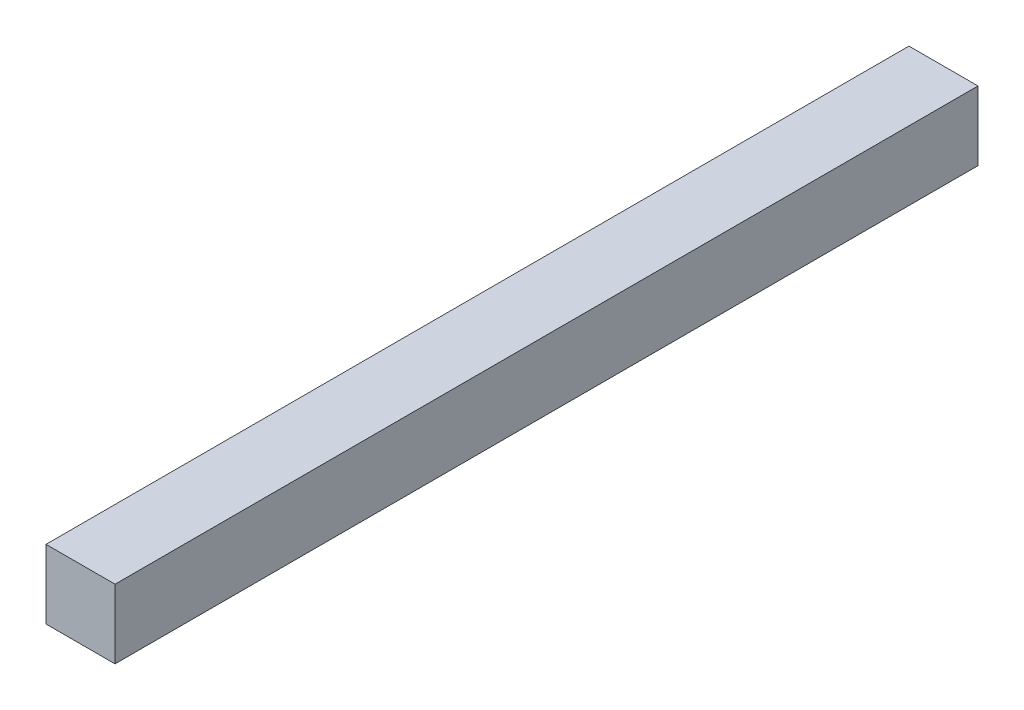
ISO-10303-21;
HEADER;
FILE_DESCRIPTION(('STEP AP214'),'2;1');
FILE_NAME('part.step','',(''),(''),'','','');
FILE_SCHEMA(('AUTOMOTIVE_DESIGN { 1 0 10303 214 1 1 1 1 }'));
ENDSEC;
DATA;
#1=APPLICATION_CONTEXT('core data for automotive mechanical design processes');
#2=APPLICATION_PROTOCOL_DEFINITION('international standard','automotive_design',2000,#1);
#3=PRODUCT_CONTEXT('',#1,'mechanical');
#4=PRODUCT('Part','Part','',(#3));
#5=PRODUCT_RELATED_PRODUCT_CATEGORY('part','',(#4));
#6=PRODUCT_DEFINITION_FORMATION('','',#4);
#7=PRODUCT_DEFINITION_CONTEXT('part definition',#1,'design');
#8=PRODUCT_DEFINITION('design','',#6,#7);
#9=PRODUCT_DEFINITION_SHAPE('','',#8);
#10=(LENGTH_UNIT() NAMED_UNIT(*) SI_UNIT(.MILLI.,.METRE.));
#11=(NAMED_UNIT(*) PLANE_ANGLE_UNIT() SI_UNIT($,.RADIAN.));
#12=(NAMED_UNIT(*) SI_UNIT($,.STERADIAN.) SOLID_ANGLE_UNIT());
#13=UNCERTAINTY_MEASURE_WITH_UNIT(LENGTH_MEASURE(1.E-05),#10,'distance_accuracy_value','');
#14=(GEOMETRIC_REPRESENTATION_CONTEXT(3) GLOBAL_UNCERTAINTY_ASSIGNED_CONTEXT((#13)) GLOBAL_UNIT_ASSIGNED_CONTEXT((#10,
#11,#12)) REPRESENTATION_CONTEXT('',''));
#15=CARTESIAN_POINT('',(0.,0.,0.));
#16=DIRECTION('',(0.,0.,1.));
#17=DIRECTION('',(1.,0.,0.));
#18=AXIS2_PLACEMENT_3D('',#15,#16,#17);
#19=CARTESIAN_POINT('',(0.,40.,1000.));
#20=DIRECTION('',(0.,-1.,0.));
#21=DIRECTION('',(0.,0.,-1.));
#22=AXIS2_PLACEMENT_3D('',#19,#20,#21);
#23=PLANE('',#22);
#24=DIRECTION('',(-1.,0.,0.));
#25=VECTOR('',#24,1.);
#26=CARTESIAN_POINT('',(0.,40.,0.));
#27=LINE('',#26,#25);
#28=CARTESIAN_POINT('',(40.,40.,0.));
#29=VERTEX_POINT('',#28);
#30=CARTESIAN_POINT('',(-40.,40.,0.));
#31=VERTEX_POINT('',#30);
#32=EDGE_CURVE('E73',#29,#31,#27,.T.);
#33=ORIENTED_EDGE('',*,*,#32,.T.);
#34=DIRECTION('',(0.,0.,-1.));
#35=VECTOR('',#34,1.);
#36=CARTESIAN_POINT('',(-40.,40.,1000.));
#37=LINE('',#36,#35);
#38=CARTESIAN_POINT('',(-40.,40.,1000.));
#39=VERTEX_POINT('',#38);
#40=EDGE_CURVE('E11',#39,#31,#37,.T.);
#41=ORIENTED_EDGE('',*,*,#40,.F.);
#42=DIRECTION('',(-1.,0.,0.));
#43=VECTOR('',#42,1.);
#44=CARTESIAN_POINT('',(40.,40.,1000.));
#45=LINE('',#44,#43);
#46=CARTESIAN_POINT('',(40.,40.,1000.));
#47=VERTEX_POINT('',#46);
#48=EDGE_CURVE('E77',#47,#39,#45,.T.);
#49=ORIENTED_EDGE('',*,*,#48,.F.);
#50=DIRECTION('',(0.,0.,-1.));
#51=VECTOR('',#50,1.);
#52=CARTESIAN_POINT('',(40.,40.,1000.));
#53=LINE('',#52,#51);
#54=EDGE_CURVE('E96',#47,#29,#53,.T.);
#55=ORIENTED_EDGE('',*,*,#54,.T.);
#56=EDGE_LOOP('',(#33,#41,#49,#55));
#57=FACE_BOUND('',#56,.T.);
#58=ADVANCED_FACE('F36',(#57),#23,.F.);
#59=CARTESIAN_POINT('',(-40.,40.,1000.));
#60=DIRECTION('',(1.,0.,0.));
#61=DIRECTION('',(0.,0.,-1.));
#62=AXIS2_PLACEMENT_3D('',#59,#60,#61);
#63=PLANE('',#62);
#64=DIRECTION('',(0.,-1.,0.));
#65=VECTOR('',#64,1.);
#66=CARTESIAN_POINT('',(-40.,40.,0.));
#67=LINE('',#66,#65);
#68=CARTESIAN_POINT('',(-40.,-40.,0.));
#69=VERTEX_POINT('',#68);
#70=EDGE_CURVE('E90',#31,#69,#67,.T.);
#71=ORIENTED_EDGE('',*,*,#70,.T.);
#72=DIRECTION('',(0.,0.,-1.));
#73=VECTOR('',#72,1.);
#74=CARTESIAN_POINT('',(-40.,-40.,1000.));
#75=LINE('',#74,#73);
#76=CARTESIAN_POINT('',(-40.,-40.,1000.));
#77=VERTEX_POINT('',#76);
#78=EDGE_CURVE('E44',#77,#69,#75,.T.);
#79=ORIENTED_EDGE('',*,*,#78,.F.);
#80=DIRECTION('',(0.,-1.,0.));
#81=VECTOR('',#80,1.);
#82=CARTESIAN_POINT('',(-40.,40.,1000.));
#83=LINE('',#82,#81);
#84=EDGE_CURVE('E80',#39,#77,#83,.T.);
#85=ORIENTED_EDGE('',*,*,#84,.F.);
#86=ORIENTED_EDGE('',*,*,#40,.T.);
#87=EDGE_LOOP('',(#71,#79,#85,#86));
#88=FACE_BOUND('',#87,.T.);
#89=ADVANCED_FACE('F89',(#88),#63,.F.);
#90=CARTESIAN_POINT('',(-40.,-40.,1000.));
#91=DIRECTION('',(0.,1.,0.));
#92=DIRECTION('',(0.,0.,1.));
#93=AXIS2_PLACEMENT_3D('',#90,#91,#92);
#94=PLANE('',#93);
#95=DIRECTION('',(1.,0.,0.));
#96=VECTOR('',#95,1.);
#97=CARTESIAN_POINT('',(-40.,-40.,0.));
#98=LINE('',#97,#96);
#99=CARTESIAN_POINT('',(40.,-40.,0.));
#100=VERTEX_POINT('',#99);
#101=EDGE_CURVE('E102',#69,#100,#98,.T.);
#102=ORIENTED_EDGE('',*,*,#101,.T.);
#103=DIRECTION('',(0.,0.,-1.));
#104=VECTOR('',#103,1.);
#105=CARTESIAN_POINT('',(40.,-40.,1000.));
#106=LINE('',#105,#104);
#107=CARTESIAN_POINT('',(40.,-40.,1000.));
#108=VERTEX_POINT('',#107);
#109=EDGE_CURVE('E92',#108,#100,#106,.T.);
#110=ORIENTED_EDGE('',*,*,#109,.F.);
#111=DIRECTION('',(1.,0.,0.));
#112=VECTOR('',#111,1.);
#113=CARTESIAN_POINT('',(-40.,-40.,1000.));
#114=LINE('',#113,#112);
#115=EDGE_CURVE('E84',#77,#108,#114,.T.);
#116=ORIENTED_EDGE('',*,*,#115,.F.);
#117=ORIENTED_EDGE('',*,*,#78,.T.);
#118=EDGE_LOOP('',(#102,#110,#116,#117));
#119=FACE_BOUND('',#118,.T.);
#120=ADVANCED_FACE('F93',(#119),#94,.F.);
#121=CARTESIAN_POINT('',(40.,0.,1000.));
#122=DIRECTION('',(-1.,0.,0.));
#123=DIRECTION('',(0.,0.,1.));
#124=AXIS2_PLACEMENT_3D('',#121,#122,#123);
#125=PLANE('',#124);
#126=DIRECTION('',(0.,1.,0.));
#127=VECTOR('',#126,1.);
#128=CARTESIAN_POINT('',(40.,0.,0.));
#129=LINE('',#128,#127);
#130=EDGE_CURVE('E69',#100,#29,#129,.T.);
#131=ORIENTED_EDGE('',*,*,#130,.T.);
#132=ORIENTED_EDGE('',*,*,#54,.F.);
#133=DIRECTION('',(0.,1.,0.));
#134=VECTOR('',#133,1.);
#135=CARTESIAN_POINT('',(40.,-40.,1000.));
#136=LINE('',#135,#134);
#137=EDGE_CURVE('E52',#108,#47,#136,.T.);
#138=ORIENTED_EDGE('',*,*,#137,.F.);
#139=ORIENTED_EDGE('',*,*,#109,.T.);
#140=EDGE_LOOP('',(#131,#132,#138,#139));
#141=FACE_BOUND('',#140,.T.);
#142=ADVANCED_FACE('F108',(#141),#125,.F.);
#143=CARTESIAN_POINT('',(0.,0.,1000.));
#144=DIRECTION('',(0.,0.,1.));
#145=DIRECTION('',(1.,0.,0.));
#146=AXIS2_PLACEMENT_3D('',#143,#144,#145);
#147=PLANE('',#146);
#148=ORIENTED_EDGE('',*,*,#48,.T.);
#149=ORIENTED_EDGE('',*,*,#84,.T.);
#150=ORIENTED_EDGE('',*,*,#115,.T.);
#151=ORIENTED_EDGE('',*,*,#137,.T.);
#152=EDGE_LOOP('',(#148,#149,#150,#151));
#153=FACE_BOUND('',#152,.T.);
#154=ADVANCED_FACE('F82',(#153),#147,.T.);
#155=CARTESIAN_POINT('',(0.,0.,0.));
#156=DIRECTION('',(0.,0.,1.));
#157=DIRECTION('',(1.,0.,0.));
#158=AXIS2_PLACEMENT_3D('',#155,#156,#157);
#159=PLANE('',#158);
#160=ORIENTED_EDGE('',*,*,#32,.F.);
#161=ORIENTED_EDGE('',*,*,#130,.F.);
#162=ORIENTED_EDGE('',*,*,#101,.F.);
#163=ORIENTED_EDGE('',*,*,#70,.F.);
#164=EDGE_LOOP('',(#160,#161,#162,#163));
#165=FACE_BOUND('',#164,.T.);
#166=ADVANCED_FACE('F110',(#165),#159,.F.);
#167=CLOSED_SHELL('',(#58,#89,#120,#142,#154,#166));
#168=MANIFOLD_SOLID_BREP('B2',#167);
#169=ADVANCED_BREP_SHAPE_REPRESENTATION('',(#18,#168),#14);
#170=SHAPE_DEFINITION_REPRESENTATION(#9,#169);
ENDSEC;
END-ISO-10303-21;
